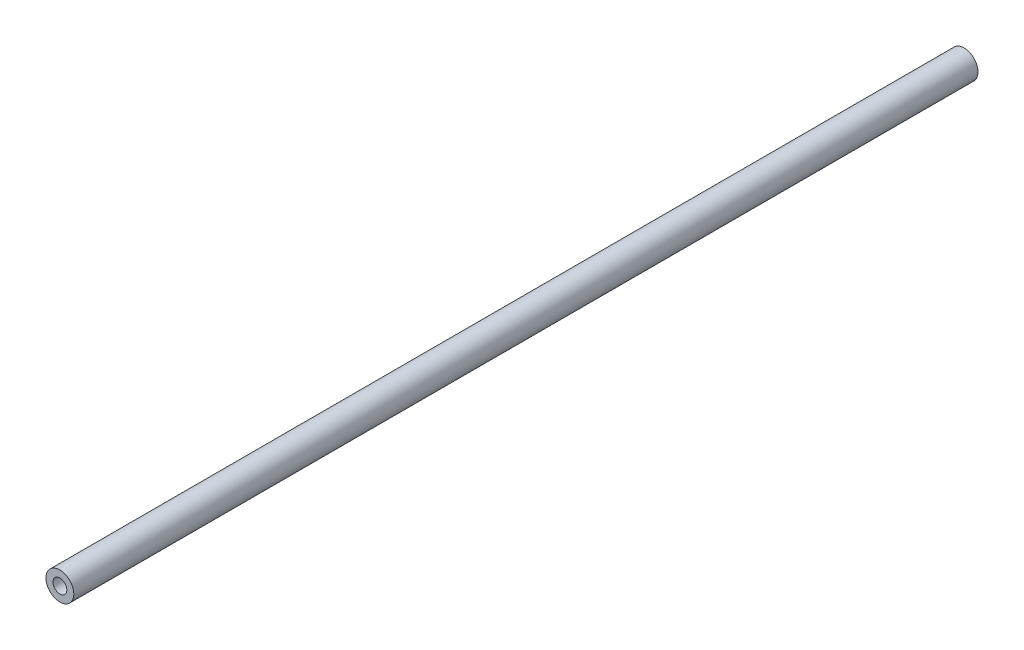
ISO-10303-21;
HEADER;
FILE_DESCRIPTION(('STEP AP214'),'2;1');
FILE_NAME('part.step','',(''),(''),'','','');
FILE_SCHEMA(('AUTOMOTIVE_DESIGN { 1 0 10303 214 1 1 1 1 }'));
ENDSEC;
DATA;
#1=APPLICATION_CONTEXT('core data for automotive mechanical design processes');
#2=APPLICATION_PROTOCOL_DEFINITION('international standard','automotive_design',2000,#1);
#3=PRODUCT_CONTEXT('',#1,'mechanical');
#4=PRODUCT('Part','Part','',(#3));
#5=PRODUCT_RELATED_PRODUCT_CATEGORY('part','',(#4));
#6=PRODUCT_DEFINITION_FORMATION('','',#4);
#7=PRODUCT_DEFINITION_CONTEXT('part definition',#1,'design');
#8=PRODUCT_DEFINITION('design','',#6,#7);
#9=PRODUCT_DEFINITION_SHAPE('','',#8);
#10=(LENGTH_UNIT() NAMED_UNIT(*) SI_UNIT(.MILLI.,.METRE.));
#11=(NAMED_UNIT(*) PLANE_ANGLE_UNIT() SI_UNIT($,.RADIAN.));
#12=(NAMED_UNIT(*) SI_UNIT($,.STERADIAN.) SOLID_ANGLE_UNIT());
#13=UNCERTAINTY_MEASURE_WITH_UNIT(LENGTH_MEASURE(1.E-05),#10,'distance_accuracy_value','');
#14=(GEOMETRIC_REPRESENTATION_CONTEXT(3) GLOBAL_UNCERTAINTY_ASSIGNED_CONTEXT((#13)) GLOBAL_UNIT_ASSIGNED_CONTEXT((#10,
#11,#12)) REPRESENTATION_CONTEXT('',''));
#15=CARTESIAN_POINT('',(0.,0.,0.));
#16=DIRECTION('',(0.,0.,1.));
#17=DIRECTION('',(1.,0.,0.));
#18=AXIS2_PLACEMENT_3D('',#15,#16,#17);
#19=CARTESIAN_POINT('',(0.,0.,260.));
#20=DIRECTION('',(0.,0.,-1.));
#21=DIRECTION('',(-1.,0.,0.));
#22=AXIS2_PLACEMENT_3D('',#19,#20,#21);
#23=CYLINDRICAL_SURFACE('',#22,4.);
#24=CARTESIAN_POINT('',(0.,0.,260.));
#25=DIRECTION('',(0.,0.,1.));
#26=DIRECTION('',(1.,0.,0.));
#27=AXIS2_PLACEMENT_3D('',#24,#25,#26);
#28=CIRCLE('',#27,4.);
#29=CARTESIAN_POINT('',(4.,0.,260.));
#30=VERTEX_POINT('',#29);
#31=EDGE_CURVE('E10',#30,#30,#28,.T.);
#32=ORIENTED_EDGE('',*,*,#31,.F.);
#33=EDGE_LOOP('',(#32));
#34=FACE_BOUND('',#33,.T.);
#35=CARTESIAN_POINT('',(0.,0.,0.));
#36=DIRECTION('',(0.,0.,1.));
#37=DIRECTION('',(1.,0.,0.));
#38=AXIS2_PLACEMENT_3D('',#35,#36,#37);
#39=CIRCLE('',#38,4.);
#40=CARTESIAN_POINT('',(4.,0.,0.));
#41=VERTEX_POINT('',#40);
#42=EDGE_CURVE('E37',#41,#41,#39,.T.);
#43=ORIENTED_EDGE('',*,*,#42,.T.);
#44=EDGE_LOOP('',(#43));
#45=FACE_BOUND('',#44,.T.);
#46=ADVANCED_FACE('F34',(#34,#45),#23,.T.);
#47=CARTESIAN_POINT('',(0.,0.,260.));
#48=DIRECTION('',(0.,0.,1.));
#49=DIRECTION('',(1.,0.,0.));
#50=AXIS2_PLACEMENT_3D('',#47,#48,#49);
#51=PLANE('',#50);
#52=CARTESIAN_POINT('',(0.,0.,260.));
#53=DIRECTION('',(0.,0.,1.));
#54=DIRECTION('',(1.,0.,0.));
#55=AXIS2_PLACEMENT_3D('',#52,#53,#54);
#56=CIRCLE('',#55,2.);
#57=CARTESIAN_POINT('',(2.,0.,260.));
#58=VERTEX_POINT('',#57);
#59=EDGE_CURVE('E46',#58,#58,#56,.T.);
#60=ORIENTED_EDGE('',*,*,#59,.F.);
#61=EDGE_LOOP('',(#60));
#62=FACE_BOUND('',#61,.T.);
#63=ORIENTED_EDGE('',*,*,#31,.T.);
#64=EDGE_LOOP('',(#63));
#65=FACE_BOUND('',#64,.T.);
#66=ADVANCED_FACE('F71',(#62,#65),#51,.T.);
#67=CARTESIAN_POINT('',(0.,0.,0.));
#68=DIRECTION('',(0.,0.,1.));
#69=DIRECTION('',(1.,0.,0.));
#70=AXIS2_PLACEMENT_3D('',#67,#68,#69);
#71=PLANE('',#70);
#72=CARTESIAN_POINT('',(0.,0.,0.));
#73=DIRECTION('',(0.,0.,-1.));
#74=DIRECTION('',(-1.,0.,0.));
#75=AXIS2_PLACEMENT_3D('',#72,#73,#74);
#76=CIRCLE('',#75,2.);
#77=CARTESIAN_POINT('',(-2.,0.,0.));
#78=VERTEX_POINT('',#77);
#79=EDGE_CURVE('E52',#78,#78,#76,.T.);
#80=ORIENTED_EDGE('',*,*,#79,.F.);
#81=EDGE_LOOP('',(#80));
#82=FACE_BOUND('',#81,.T.);
#83=ORIENTED_EDGE('',*,*,#42,.F.);
#84=EDGE_LOOP('',(#83));
#85=FACE_BOUND('',#84,.T.);
#86=ADVANCED_FACE('F67',(#82,#85),#71,.F.);
#87=CARTESIAN_POINT('',(0.,0.,250.));
#88=DIRECTION('',(0.,0.,1.));
#89=DIRECTION('',(1.,0.,0.));
#90=AXIS2_PLACEMENT_3D('',#87,#88,#89);
#91=CYLINDRICAL_SURFACE('',#90,2.);
#92=CARTESIAN_POINT('',(0.,0.,250.));
#93=DIRECTION('',(0.,0.,1.));
#94=DIRECTION('',(1.,0.,0.));
#95=AXIS2_PLACEMENT_3D('',#92,#93,#94);
#96=CIRCLE('',#95,2.);
#97=CARTESIAN_POINT('',(2.,0.,250.));
#98=VERTEX_POINT('',#97);
#99=EDGE_CURVE('E44',#98,#98,#96,.T.);
#100=ORIENTED_EDGE('',*,*,#99,.F.);
#101=EDGE_LOOP('',(#100));
#102=FACE_BOUND('',#101,.T.);
#103=ORIENTED_EDGE('',*,*,#59,.T.);
#104=EDGE_LOOP('',(#103));
#105=FACE_BOUND('',#104,.T.);
#106=ADVANCED_FACE('F70',(#102,#105),#91,.F.);
#107=CARTESIAN_POINT('',(0.,0.,250.));
#108=DIRECTION('',(0.,0.,1.));
#109=DIRECTION('',(1.,0.,0.));
#110=AXIS2_PLACEMENT_3D('',#107,#108,#109);
#111=PLANE('',#110);
#112=ORIENTED_EDGE('',*,*,#99,.T.);
#113=EDGE_LOOP('',(#112));
#114=FACE_BOUND('',#113,.T.);
#115=ADVANCED_FACE('F63',(#114),#111,.T.);
#116=CARTESIAN_POINT('',(0.,0.,10.));
#117=DIRECTION('',(0.,0.,-1.));
#118=DIRECTION('',(-1.,0.,0.));
#119=AXIS2_PLACEMENT_3D('',#116,#117,#118);
#120=CYLINDRICAL_SURFACE('',#119,2.);
#121=CARTESIAN_POINT('',(0.,0.,10.));
#122=DIRECTION('',(0.,0.,-1.));
#123=DIRECTION('',(-1.,0.,0.));
#124=AXIS2_PLACEMENT_3D('',#121,#122,#123);
#125=CIRCLE('',#124,2.);
#126=CARTESIAN_POINT('',(-2.,0.,10.));
#127=VERTEX_POINT('',#126);
#128=EDGE_CURVE('E49',#127,#127,#125,.T.);
#129=ORIENTED_EDGE('',*,*,#128,.F.);
#130=EDGE_LOOP('',(#129));
#131=FACE_BOUND('',#130,.T.);
#132=ORIENTED_EDGE('',*,*,#79,.T.);
#133=EDGE_LOOP('',(#132));
#134=FACE_BOUND('',#133,.T.);
#135=ADVANCED_FACE('F60',(#131,#134),#120,.F.);
#136=CARTESIAN_POINT('',(0.,0.,10.));
#137=DIRECTION('',(0.,0.,-1.));
#138=DIRECTION('',(-1.,0.,0.));
#139=AXIS2_PLACEMENT_3D('',#136,#137,#138);
#140=PLANE('',#139);
#141=ORIENTED_EDGE('',*,*,#128,.T.);
#142=EDGE_LOOP('',(#141));
#143=FACE_BOUND('',#142,.T.);
#144=ADVANCED_FACE('F58',(#143),#140,.T.);
#145=CLOSED_SHELL('',(#46,#66,#86,#106,#115,#135,#144));
#146=MANIFOLD_SOLID_BREP('B2',#145);
#147=ADVANCED_BREP_SHAPE_REPRESENTATION('',(#18,#146),#14);
#148=SHAPE_DEFINITION_REPRESENTATION(#9,#147);
ENDSEC;
END-ISO-10303-21;
